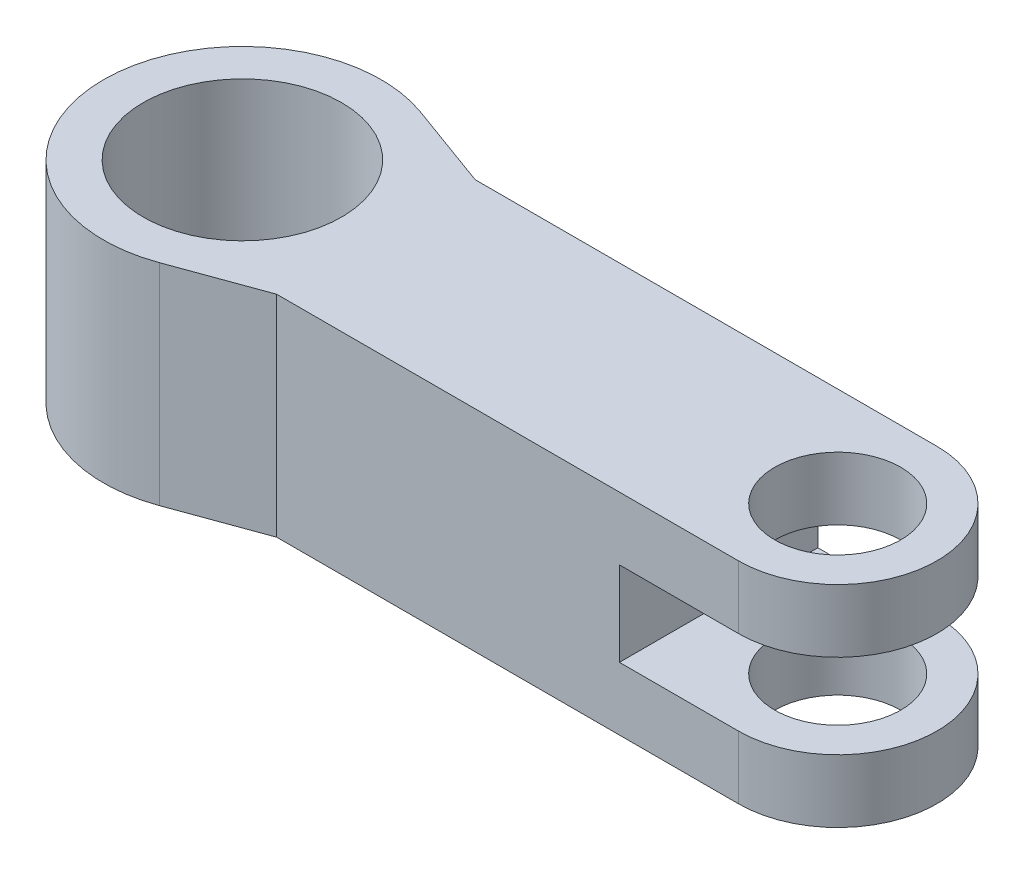
ISO-10303-21;
HEADER;
FILE_DESCRIPTION(('STEP AP214'),'2;1');
FILE_NAME('part.step','',(''),(''),'','','');
FILE_SCHEMA(('AUTOMOTIVE_DESIGN { 1 0 10303 214 1 1 1 1 }'));
ENDSEC;
DATA;
#1=APPLICATION_CONTEXT('core data for automotive mechanical design processes');
#2=APPLICATION_PROTOCOL_DEFINITION('international standard','automotive_design',2000,#1);
#3=PRODUCT_CONTEXT('',#1,'mechanical');
#4=PRODUCT('Part','Part','',(#3));
#5=PRODUCT_RELATED_PRODUCT_CATEGORY('part','',(#4));
#6=PRODUCT_DEFINITION_FORMATION('','',#4);
#7=PRODUCT_DEFINITION_CONTEXT('part definition',#1,'design');
#8=PRODUCT_DEFINITION('design','',#6,#7);
#9=PRODUCT_DEFINITION_SHAPE('','',#8);
#10=(LENGTH_UNIT() NAMED_UNIT(*) SI_UNIT(.MILLI.,.METRE.));
#11=(NAMED_UNIT(*) PLANE_ANGLE_UNIT() SI_UNIT($,.RADIAN.));
#12=(NAMED_UNIT(*) SI_UNIT($,.STERADIAN.) SOLID_ANGLE_UNIT());
#13=UNCERTAINTY_MEASURE_WITH_UNIT(LENGTH_MEASURE(1.E-05),#10,'distance_accuracy_value','');
#14=(GEOMETRIC_REPRESENTATION_CONTEXT(3) GLOBAL_UNCERTAINTY_ASSIGNED_CONTEXT((#13)) GLOBAL_UNIT_ASSIGNED_CONTEXT((#10,
#11,#12)) REPRESENTATION_CONTEXT('',''));
#15=CARTESIAN_POINT('',(0.,0.,0.));
#16=DIRECTION('',(0.,0.,1.));
#17=DIRECTION('',(1.,0.,0.));
#18=AXIS2_PLACEMENT_3D('',#15,#16,#17);
#19=CARTESIAN_POINT('',(16.,-44.175,0.));
#20=DIRECTION('',(0.,-1.,0.));
#21=DIRECTION('',(1.,0.,0.));
#22=AXIS2_PLACEMENT_3D('',#19,#20,#21);
#23=PLANE('',#22);
#24=CARTESIAN_POINT('',(32.,-44.175,0.));
#25=DIRECTION('',(0.,-1.,0.));
#26=DIRECTION('',(0.,0.,-1.));
#27=AXIS2_PLACEMENT_3D('',#24,#25,#26);
#28=CIRCLE('',#27,3.175);
#29=CARTESIAN_POINT('',(32.,-44.175,-3.175));
#30=VERTEX_POINT('',#29);
#31=EDGE_CURVE('E131',#30,#30,#28,.T.);
#32=ORIENTED_EDGE('',*,*,#31,.F.);
#33=EDGE_LOOP('',(#32));
#34=FACE_BOUND('',#33,.T.);
#35=DIRECTION('',(1.,0.,0.));
#36=VECTOR('',#35,1.);
#37=CARTESIAN_POINT('',(20.3646218519343,-44.175,5.));
#38=LINE('',#37,#36);
#39=CARTESIAN_POINT('',(26.,-44.175,5.));
#40=VERTEX_POINT('',#39);
#41=CARTESIAN_POINT('',(32.,-44.175,5.));
#42=VERTEX_POINT('',#41);
#43=EDGE_CURVE('E124',#40,#42,#38,.T.);
#44=ORIENTED_EDGE('',*,*,#43,.F.);
#45=DIRECTION('',(0.,0.,-1.));
#46=VECTOR('',#45,1.);
#47=CARTESIAN_POINT('',(26.,-44.175,0.));
#48=LINE('',#47,#46);
#49=CARTESIAN_POINT('',(26.,-44.175,-5.));
#50=VERTEX_POINT('',#49);
#51=EDGE_CURVE('E117',#40,#50,#48,.T.);
#52=ORIENTED_EDGE('',*,*,#51,.T.);
#53=DIRECTION('',(1.,0.,0.));
#54=VECTOR('',#53,1.);
#55=CARTESIAN_POINT('',(20.3646218519343,-44.175,-5.));
#56=LINE('',#55,#54);
#57=CARTESIAN_POINT('',(32.,-44.175,-5.));
#58=VERTEX_POINT('',#57);
#59=EDGE_CURVE('E120',#50,#58,#56,.T.);
#60=ORIENTED_EDGE('',*,*,#59,.T.);
#61=CARTESIAN_POINT('',(32.,-44.175,0.));
#62=DIRECTION('',(0.,-1.,0.));
#63=DIRECTION('',(0.,0.,-1.));
#64=AXIS2_PLACEMENT_3D('',#61,#62,#63);
#65=CIRCLE('',#64,5.);
#66=EDGE_CURVE('E126',#58,#42,#65,.T.);
#67=ORIENTED_EDGE('',*,*,#66,.T.);
#68=EDGE_LOOP('',(#44,#52,#60,#67));
#69=FACE_BOUND('',#68,.T.);
#70=ADVANCED_FACE('F17',(#34,#69),#23,.T.);
#71=CARTESIAN_POINT('',(2.,-44.302,0.));
#72=DIRECTION('',(0.,1.,0.));
#73=DIRECTION('',(0.,0.,1.));
#74=AXIS2_PLACEMENT_3D('',#71,#72,#73);
#75=CYLINDRICAL_SURFACE('',#74,7.);
#76=CARTESIAN_POINT('',(2.,-41.,0.));
#77=DIRECTION('',(0.,-1.,0.));
#78=DIRECTION('',(0.,0.,-1.));
#79=AXIS2_PLACEMENT_3D('',#76,#77,#78);
#80=CIRCLE('',#79,7.);
#81=CARTESIAN_POINT('',(4.39414100327968,-41.,6.57784834550136));
#82=VERTEX_POINT('',#81);
#83=CARTESIAN_POINT('',(4.39414100327967,-41.,-6.57784834550136));
#84=VERTEX_POINT('',#83);
#85=EDGE_CURVE('E177',#82,#84,#80,.T.);
#86=ORIENTED_EDGE('',*,*,#85,.T.);
#87=DIRECTION('',(0.,1.,0.));
#88=VECTOR('',#87,1.);
#89=CARTESIAN_POINT('',(4.39414100327967,-44.302,-6.57784834550136));
#90=LINE('',#89,#88);
#91=CARTESIAN_POINT('',(4.39414100327967,-51.604,-6.57784834550136));
#92=VERTEX_POINT('',#91);
#93=EDGE_CURVE('E11',#92,#84,#90,.T.);
#94=ORIENTED_EDGE('',*,*,#93,.F.);
#95=CARTESIAN_POINT('',(2.,-51.604,0.));
#96=DIRECTION('',(0.,-1.,0.));
#97=DIRECTION('',(0.,0.,-1.));
#98=AXIS2_PLACEMENT_3D('',#95,#96,#97);
#99=CIRCLE('',#98,7.);
#100=CARTESIAN_POINT('',(4.39414100327968,-51.604,6.57784834550136));
#101=VERTEX_POINT('',#100);
#102=EDGE_CURVE('E204',#101,#92,#99,.T.);
#103=ORIENTED_EDGE('',*,*,#102,.F.);
#104=DIRECTION('',(0.,1.,0.));
#105=VECTOR('',#104,1.);
#106=CARTESIAN_POINT('',(4.39414100327968,-44.302,6.57784834550136));
#107=LINE('',#106,#105);
#108=EDGE_CURVE('E130',#101,#82,#107,.T.);
#109=ORIENTED_EDGE('',*,*,#108,.T.);
#110=EDGE_LOOP('',(#86,#94,#103,#109));
#111=FACE_BOUND('',#110,.T.);
#112=ADVANCED_FACE('F304',(#111),#75,.T.);
#113=CARTESIAN_POINT('',(6.56169235357409,-44.302,-5.78892417275068));
#114=DIRECTION('',(-0.342020143325668,0.,0.939692620785908));
#115=DIRECTION('',(0.939692620785909,0.,0.342020143325668));
#116=AXIS2_PLACEMENT_3D('',#113,#114,#115);
#117=PLANE('',#116);
#118=DIRECTION('',(0.939692620785909,0.,0.342020143325668));
#119=VECTOR('',#118,1.);
#120=CARTESIAN_POINT('',(6.56169235357409,-41.,-5.78892417275068));
#121=LINE('',#120,#119);
#122=CARTESIAN_POINT('',(8.7292437038685,-41.,-5.));
#123=VERTEX_POINT('',#122);
#124=EDGE_CURVE('E173',#84,#123,#121,.T.);
#125=ORIENTED_EDGE('',*,*,#124,.T.);
#126=DIRECTION('',(0.,1.,0.));
#127=VECTOR('',#126,1.);
#128=CARTESIAN_POINT('',(8.7292437038685,-44.302,-5.));
#129=LINE('',#128,#127);
#130=CARTESIAN_POINT('',(8.7292437038685,-51.604,-5.));
#131=VERTEX_POINT('',#130);
#132=EDGE_CURVE('E28',#131,#123,#129,.T.);
#133=ORIENTED_EDGE('',*,*,#132,.F.);
#134=DIRECTION('',(0.939692620785909,0.,0.342020143325668));
#135=VECTOR('',#134,1.);
#136=CARTESIAN_POINT('',(6.56169235357409,-51.604,-5.78892417275068));
#137=LINE('',#136,#135);
#138=EDGE_CURVE('E200',#92,#131,#137,.T.);
#139=ORIENTED_EDGE('',*,*,#138,.F.);
#140=ORIENTED_EDGE('',*,*,#93,.T.);
#141=EDGE_LOOP('',(#125,#133,#139,#140));
#142=FACE_BOUND('',#141,.T.);
#143=ADVANCED_FACE('F309',(#142),#117,.F.);
#144=CARTESIAN_POINT('',(20.3646218519343,-44.302,-5.));
#145=DIRECTION('',(0.,0.,1.));
#146=DIRECTION('',(1.,0.,0.));
#147=AXIS2_PLACEMENT_3D('',#144,#145,#146);
#148=PLANE('',#147);
#149=DIRECTION('',(1.,0.,0.));
#150=VECTOR('',#149,1.);
#151=CARTESIAN_POINT('',(20.3646218519343,-41.,-5.));
#152=LINE('',#151,#150);
#153=CARTESIAN_POINT('',(32.,-41.,-5.));
#154=VERTEX_POINT('',#153);
#155=EDGE_CURVE('E169',#123,#154,#152,.T.);
#156=ORIENTED_EDGE('',*,*,#155,.T.);
#157=DIRECTION('',(0.,1.,0.));
#158=VECTOR('',#157,1.);
#159=CARTESIAN_POINT('',(32.,-44.302,-5.));
#160=LINE('',#159,#158);
#161=EDGE_CURVE('E143',#58,#154,#160,.T.);
#162=ORIENTED_EDGE('',*,*,#161,.F.);
#163=ORIENTED_EDGE('',*,*,#59,.F.);
#164=DIRECTION('',(0.,1.,0.));
#165=VECTOR('',#164,1.);
#166=CARTESIAN_POINT('',(26.,-48.304,-5.));
#167=LINE('',#166,#165);
#168=CARTESIAN_POINT('',(26.,-48.429,-5.));
#169=VERTEX_POINT('',#168);
#170=EDGE_CURVE('E42',#169,#50,#167,.T.);
#171=ORIENTED_EDGE('',*,*,#170,.F.);
#172=DIRECTION('',(1.,0.,0.));
#173=VECTOR('',#172,1.);
#174=CARTESIAN_POINT('',(20.3646218519343,-48.429,-5.));
#175=LINE('',#174,#173);
#176=CARTESIAN_POINT('',(32.,-48.429,-5.));
#177=VERTEX_POINT('',#176);
#178=EDGE_CURVE('E82',#169,#177,#175,.T.);
#179=ORIENTED_EDGE('',*,*,#178,.T.);
#180=DIRECTION('',(0.,1.,0.));
#181=VECTOR('',#180,1.);
#182=CARTESIAN_POINT('',(32.,-51.604,-5.));
#183=LINE('',#182,#181);
#184=CARTESIAN_POINT('',(32.,-51.604,-5.));
#185=VERTEX_POINT('',#184);
#186=EDGE_CURVE('E95',#185,#177,#183,.T.);
#187=ORIENTED_EDGE('',*,*,#186,.F.);
#188=DIRECTION('',(1.,0.,0.));
#189=VECTOR('',#188,1.);
#190=CARTESIAN_POINT('',(20.3646218519343,-51.604,-5.));
#191=LINE('',#190,#189);
#192=EDGE_CURVE('E196',#131,#185,#191,.T.);
#193=ORIENTED_EDGE('',*,*,#192,.F.);
#194=ORIENTED_EDGE('',*,*,#132,.T.);
#195=EDGE_LOOP('',(#156,#162,#163,#171,#179,#187,#193,#194));
#196=FACE_BOUND('',#195,.T.);
#197=ADVANCED_FACE('F283',(#196),#148,.F.);
#198=CARTESIAN_POINT('',(32.,-44.302,0.));
#199=DIRECTION('',(0.,1.,0.));
#200=DIRECTION('',(0.,0.,1.));
#201=AXIS2_PLACEMENT_3D('',#198,#199,#200);
#202=CYLINDRICAL_SURFACE('',#201,5.);
#203=CARTESIAN_POINT('',(32.,-41.,0.));
#204=DIRECTION('',(0.,-1.,0.));
#205=DIRECTION('',(0.,0.,-1.));
#206=AXIS2_PLACEMENT_3D('',#203,#204,#205);
#207=CIRCLE('',#206,5.);
#208=CARTESIAN_POINT('',(32.,-41.,5.));
#209=VERTEX_POINT('',#208);
#210=EDGE_CURVE('E125',#154,#209,#207,.T.);
#211=ORIENTED_EDGE('',*,*,#210,.T.);
#212=DIRECTION('',(0.,1.,0.));
#213=VECTOR('',#212,1.);
#214=CARTESIAN_POINT('',(32.,-44.302,5.));
#215=LINE('',#214,#213);
#216=EDGE_CURVE('E147',#42,#209,#215,.T.);
#217=ORIENTED_EDGE('',*,*,#216,.F.);
#218=ORIENTED_EDGE('',*,*,#66,.F.);
#219=ORIENTED_EDGE('',*,*,#161,.T.);
#220=EDGE_LOOP('',(#211,#217,#218,#219));
#221=FACE_BOUND('',#220,.T.);
#222=ADVANCED_FACE('F287',(#221),#202,.T.);
#223=CARTESIAN_POINT('',(20.3646218519343,-44.302,5.));
#224=DIRECTION('',(0.,0.,1.));
#225=DIRECTION('',(1.,0.,0.));
#226=AXIS2_PLACEMENT_3D('',#223,#224,#225);
#227=PLANE('',#226);
#228=DIRECTION('',(1.,0.,0.));
#229=VECTOR('',#228,1.);
#230=CARTESIAN_POINT('',(20.3646218519343,-41.,5.));
#231=LINE('',#230,#229);
#232=CARTESIAN_POINT('',(8.7292437038685,-41.,5.));
#233=VERTEX_POINT('',#232);
#234=EDGE_CURVE('E165',#233,#209,#231,.T.);
#235=ORIENTED_EDGE('',*,*,#234,.F.);
#236=DIRECTION('',(0.,1.,0.));
#237=VECTOR('',#236,1.);
#238=CARTESIAN_POINT('',(8.7292437038685,-44.302,5.));
#239=LINE('',#238,#237);
#240=CARTESIAN_POINT('',(8.7292437038685,-51.604,5.));
#241=VERTEX_POINT('',#240);
#242=EDGE_CURVE('E138',#241,#233,#239,.T.);
#243=ORIENTED_EDGE('',*,*,#242,.F.);
#244=DIRECTION('',(1.,0.,0.));
#245=VECTOR('',#244,1.);
#246=CARTESIAN_POINT('',(20.3646218519343,-51.604,5.));
#247=LINE('',#246,#245);
#248=CARTESIAN_POINT('',(32.,-51.604,5.));
#249=VERTEX_POINT('',#248);
#250=EDGE_CURVE('E91',#241,#249,#247,.T.);
#251=ORIENTED_EDGE('',*,*,#250,.T.);
#252=DIRECTION('',(0.,1.,0.));
#253=VECTOR('',#252,1.);
#254=CARTESIAN_POINT('',(32.,-51.604,5.));
#255=LINE('',#254,#253);
#256=CARTESIAN_POINT('',(32.,-48.429,5.));
#257=VERTEX_POINT('',#256);
#258=EDGE_CURVE('E85',#249,#257,#255,.T.);
#259=ORIENTED_EDGE('',*,*,#258,.T.);
#260=DIRECTION('',(1.,0.,0.));
#261=VECTOR('',#260,1.);
#262=CARTESIAN_POINT('',(20.3646218519343,-48.429,5.));
#263=LINE('',#262,#261);
#264=CARTESIAN_POINT('',(26.,-48.429,5.));
#265=VERTEX_POINT('',#264);
#266=EDGE_CURVE('E72',#265,#257,#263,.T.);
#267=ORIENTED_EDGE('',*,*,#266,.F.);
#268=DIRECTION('',(0.,1.,0.));
#269=VECTOR('',#268,1.);
#270=CARTESIAN_POINT('',(26.,-48.304,5.));
#271=LINE('',#270,#269);
#272=EDGE_CURVE('E116',#265,#40,#271,.T.);
#273=ORIENTED_EDGE('',*,*,#272,.T.);
#274=ORIENTED_EDGE('',*,*,#43,.T.);
#275=ORIENTED_EDGE('',*,*,#216,.T.);
#276=EDGE_LOOP('',(#235,#243,#251,#259,#267,#273,#274,#275));
#277=FACE_BOUND('',#276,.T.);
#278=ADVANCED_FACE('F87',(#277),#227,.T.);
#279=CARTESIAN_POINT('',(6.56169235357409,-44.302,5.78892417275068));
#280=DIRECTION('',(0.342020143325669,0.,0.939692620785908));
#281=DIRECTION('',(0.939692620785909,0.,-0.342020143325669));
#282=AXIS2_PLACEMENT_3D('',#279,#280,#281);
#283=PLANE('',#282);
#284=DIRECTION('',(0.939692620785908,0.,-0.342020143325669));
#285=VECTOR('',#284,1.);
#286=CARTESIAN_POINT('',(6.56169235357409,-41.,5.78892417275068));
#287=LINE('',#286,#285);
#288=EDGE_CURVE('E161',#82,#233,#287,.T.);
#289=ORIENTED_EDGE('',*,*,#288,.F.);
#290=ORIENTED_EDGE('',*,*,#108,.F.);
#291=DIRECTION('',(0.939692620785909,0.,-0.342020143325669));
#292=VECTOR('',#291,1.);
#293=CARTESIAN_POINT('',(6.56169235357409,-51.604,5.78892417275068));
#294=LINE('',#293,#292);
#295=EDGE_CURVE('E208',#101,#241,#294,.T.);
#296=ORIENTED_EDGE('',*,*,#295,.T.);
#297=ORIENTED_EDGE('',*,*,#242,.T.);
#298=EDGE_LOOP('',(#289,#290,#296,#297));
#299=FACE_BOUND('',#298,.T.);
#300=ADVANCED_FACE('F316',(#299),#283,.T.);
#301=CARTESIAN_POINT('',(2.,-44.302,0.));
#302=DIRECTION('',(0.,1.,0.));
#303=DIRECTION('',(0.,0.,1.));
#304=AXIS2_PLACEMENT_3D('',#301,#302,#303);
#305=CYLINDRICAL_SURFACE('',#304,5.);
#306=CARTESIAN_POINT('',(2.,-41.,0.));
#307=DIRECTION('',(0.,-1.,0.));
#308=DIRECTION('',(0.,0.,-1.));
#309=AXIS2_PLACEMENT_3D('',#306,#307,#308);
#310=CIRCLE('',#309,5.);
#311=CARTESIAN_POINT('',(2.,-41.,-5.));
#312=VERTEX_POINT('',#311);
#313=EDGE_CURVE('E119',#312,#312,#310,.T.);
#314=ORIENTED_EDGE('',*,*,#313,.F.);
#315=EDGE_LOOP('',(#314));
#316=FACE_BOUND('',#315,.T.);
#317=CARTESIAN_POINT('',(2.,-51.604,0.));
#318=DIRECTION('',(0.,-1.,0.));
#319=DIRECTION('',(0.,0.,-1.));
#320=AXIS2_PLACEMENT_3D('',#317,#318,#319);
#321=CIRCLE('',#320,5.);
#322=CARTESIAN_POINT('',(2.,-51.604,-5.));
#323=VERTEX_POINT('',#322);
#324=EDGE_CURVE('E101',#323,#323,#321,.T.);
#325=ORIENTED_EDGE('',*,*,#324,.T.);
#326=EDGE_LOOP('',(#325));
#327=FACE_BOUND('',#326,.T.);
#328=ADVANCED_FACE('F314',(#316,#327),#305,.F.);
#329=CARTESIAN_POINT('',(32.,-44.302,0.));
#330=DIRECTION('',(0.,1.,0.));
#331=DIRECTION('',(0.,0.,1.));
#332=AXIS2_PLACEMENT_3D('',#329,#330,#331);
#333=CYLINDRICAL_SURFACE('',#332,3.175);
#334=ORIENTED_EDGE('',*,*,#31,.T.);
#335=EDGE_LOOP('',(#334));
#336=FACE_BOUND('',#335,.T.);
#337=CARTESIAN_POINT('',(32.,-41.,0.));
#338=DIRECTION('',(0.,-1.,0.));
#339=DIRECTION('',(0.,0.,-1.));
#340=AXIS2_PLACEMENT_3D('',#337,#338,#339);
#341=CIRCLE('',#340,3.175);
#342=CARTESIAN_POINT('',(32.,-41.,-3.175));
#343=VERTEX_POINT('',#342);
#344=EDGE_CURVE('E157',#343,#343,#341,.T.);
#345=ORIENTED_EDGE('',*,*,#344,.F.);
#346=EDGE_LOOP('',(#345));
#347=FACE_BOUND('',#346,.T.);
#348=ADVANCED_FACE('F299',(#336,#347),#333,.F.);
#349=CARTESIAN_POINT('',(16.,-41.,0.));
#350=DIRECTION('',(0.,-1.,0.));
#351=DIRECTION('',(1.,0.,0.));
#352=AXIS2_PLACEMENT_3D('',#349,#350,#351);
#353=PLANE('',#352);
#354=ORIENTED_EDGE('',*,*,#313,.T.);
#355=EDGE_LOOP('',(#354));
#356=FACE_BOUND('',#355,.T.);
#357=ORIENTED_EDGE('',*,*,#85,.F.);
#358=ORIENTED_EDGE('',*,*,#288,.T.);
#359=ORIENTED_EDGE('',*,*,#234,.T.);
#360=ORIENTED_EDGE('',*,*,#210,.F.);
#361=ORIENTED_EDGE('',*,*,#155,.F.);
#362=ORIENTED_EDGE('',*,*,#124,.F.);
#363=EDGE_LOOP('',(#357,#358,#359,#360,#361,#362));
#364=FACE_BOUND('',#363,.T.);
#365=ORIENTED_EDGE('',*,*,#344,.T.);
#366=EDGE_LOOP('',(#365));
#367=FACE_BOUND('',#366,.T.);
#368=ADVANCED_FACE('F290',(#356,#364,#367),#353,.F.);
#369=CARTESIAN_POINT('',(26.,-48.304,0.));
#370=DIRECTION('',(1.,0.,0.));
#371=DIRECTION('',(0.,0.,-1.));
#372=AXIS2_PLACEMENT_3D('',#369,#370,#371);
#373=PLANE('',#372);
#374=ORIENTED_EDGE('',*,*,#272,.F.);
#375=DIRECTION('',(0.,0.,-1.));
#376=VECTOR('',#375,1.);
#377=CARTESIAN_POINT('',(26.,-48.429,0.));
#378=LINE('',#377,#376);
#379=EDGE_CURVE('E78',#265,#169,#378,.T.);
#380=ORIENTED_EDGE('',*,*,#379,.T.);
#381=ORIENTED_EDGE('',*,*,#170,.T.);
#382=ORIENTED_EDGE('',*,*,#51,.F.);
#383=EDGE_LOOP('',(#374,#380,#381,#382));
#384=FACE_BOUND('',#383,.T.);
#385=ADVANCED_FACE('F288',(#384),#373,.T.);
#386=CARTESIAN_POINT('',(32.,-51.604,0.));
#387=DIRECTION('',(0.,1.,0.));
#388=DIRECTION('',(0.,0.,1.));
#389=AXIS2_PLACEMENT_3D('',#386,#387,#388);
#390=CYLINDRICAL_SURFACE('',#389,5.);
#391=CARTESIAN_POINT('',(32.,-48.429,0.));
#392=DIRECTION('',(0.,-1.,0.));
#393=DIRECTION('',(0.,0.,-1.));
#394=AXIS2_PLACEMENT_3D('',#391,#392,#393);
#395=CIRCLE('',#394,5.);
#396=EDGE_CURVE('E76',#177,#257,#395,.T.);
#397=ORIENTED_EDGE('',*,*,#396,.T.);
#398=ORIENTED_EDGE('',*,*,#258,.F.);
#399=CARTESIAN_POINT('',(32.,-51.604,0.));
#400=DIRECTION('',(0.,-1.,0.));
#401=DIRECTION('',(0.,0.,-1.));
#402=AXIS2_PLACEMENT_3D('',#399,#400,#401);
#403=CIRCLE('',#402,5.);
#404=EDGE_CURVE('E96',#185,#249,#403,.T.);
#405=ORIENTED_EDGE('',*,*,#404,.F.);
#406=ORIENTED_EDGE('',*,*,#186,.T.);
#407=EDGE_LOOP('',(#397,#398,#405,#406));
#408=FACE_BOUND('',#407,.T.);
#409=ADVANCED_FACE('F98',(#408),#390,.T.);
#410=CARTESIAN_POINT('',(32.,-51.604,0.));
#411=DIRECTION('',(0.,1.,0.));
#412=DIRECTION('',(0.,0.,1.));
#413=AXIS2_PLACEMENT_3D('',#410,#411,#412);
#414=CYLINDRICAL_SURFACE('',#413,3.175);
#415=CARTESIAN_POINT('',(32.,-51.604,0.));
#416=DIRECTION('',(0.,-1.,0.));
#417=DIRECTION('',(0.,0.,-1.));
#418=AXIS2_PLACEMENT_3D('',#415,#416,#417);
#419=CIRCLE('',#418,3.175);
#420=CARTESIAN_POINT('',(32.,-51.604,-3.175));
#421=VERTEX_POINT('',#420);
#422=EDGE_CURVE('E192',#421,#421,#419,.T.);
#423=ORIENTED_EDGE('',*,*,#422,.T.);
#424=EDGE_LOOP('',(#423));
#425=FACE_BOUND('',#424,.T.);
#426=CARTESIAN_POINT('',(32.,-48.429,0.));
#427=DIRECTION('',(0.,-1.,0.));
#428=DIRECTION('',(0.,0.,-1.));
#429=AXIS2_PLACEMENT_3D('',#426,#427,#428);
#430=CIRCLE('',#429,3.175);
#431=CARTESIAN_POINT('',(32.,-48.429,-3.175));
#432=VERTEX_POINT('',#431);
#433=EDGE_CURVE('E21',#432,#432,#430,.T.);
#434=ORIENTED_EDGE('',*,*,#433,.F.);
#435=EDGE_LOOP('',(#434));
#436=FACE_BOUND('',#435,.T.);
#437=ADVANCED_FACE('F297',(#425,#436),#414,.F.);
#438=CARTESIAN_POINT('',(16.,-51.604,0.));
#439=DIRECTION('',(0.,-1.,0.));
#440=DIRECTION('',(1.,0.,0.));
#441=AXIS2_PLACEMENT_3D('',#438,#439,#440);
#442=PLANE('',#441);
#443=ORIENTED_EDGE('',*,*,#324,.F.);
#444=EDGE_LOOP('',(#443));
#445=FACE_BOUND('',#444,.T.);
#446=ORIENTED_EDGE('',*,*,#192,.T.);
#447=ORIENTED_EDGE('',*,*,#404,.T.);
#448=ORIENTED_EDGE('',*,*,#250,.F.);
#449=ORIENTED_EDGE('',*,*,#295,.F.);
#450=ORIENTED_EDGE('',*,*,#102,.T.);
#451=ORIENTED_EDGE('',*,*,#138,.T.);
#452=EDGE_LOOP('',(#446,#447,#448,#449,#450,#451));
#453=FACE_BOUND('',#452,.T.);
#454=ORIENTED_EDGE('',*,*,#422,.F.);
#455=EDGE_LOOP('',(#454));
#456=FACE_BOUND('',#455,.T.);
#457=ADVANCED_FACE('F381',(#445,#453,#456),#442,.T.);
#458=CARTESIAN_POINT('',(16.,-48.429,0.));
#459=DIRECTION('',(0.,-1.,0.));
#460=DIRECTION('',(1.,0.,0.));
#461=AXIS2_PLACEMENT_3D('',#458,#459,#460);
#462=PLANE('',#461);
#463=ORIENTED_EDGE('',*,*,#379,.F.);
#464=ORIENTED_EDGE('',*,*,#266,.T.);
#465=ORIENTED_EDGE('',*,*,#396,.F.);
#466=ORIENTED_EDGE('',*,*,#178,.F.);
#467=EDGE_LOOP('',(#463,#464,#465,#466));
#468=FACE_BOUND('',#467,.T.);
#469=ORIENTED_EDGE('',*,*,#433,.T.);
#470=EDGE_LOOP('',(#469));
#471=FACE_BOUND('',#470,.T.);
#472=ADVANCED_FACE('F19',(#468,#471),#462,.F.);
#473=CLOSED_SHELL('',(#70,#112,#143,#197,#222,#278,#300,#328,#348,#368,#385,#409,#437,#457,#472));
#474=MANIFOLD_SOLID_BREP('B1',#473);
#475=ADVANCED_BREP_SHAPE_REPRESENTATION('',(#18,#474),#14);
#476=SHAPE_DEFINITION_REPRESENTATION(#9,#475);
ENDSEC;
END-ISO-10303-21;
